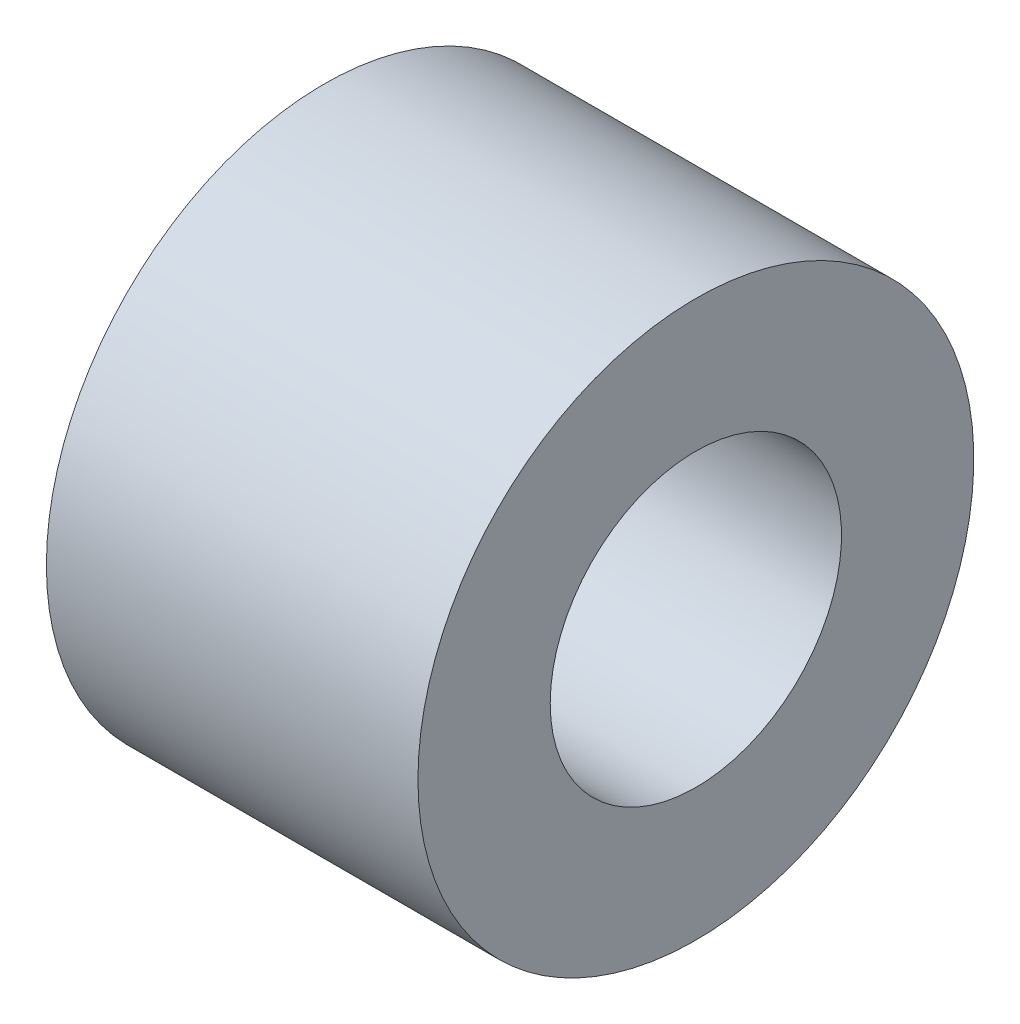
ISO-10303-21;
HEADER;
FILE_DESCRIPTION(('STEP AP214'),'2;1');
FILE_NAME('part.step','',(''),(''),'','','');
FILE_SCHEMA(('AUTOMOTIVE_DESIGN { 1 0 10303 214 1 1 1 1 }'));
ENDSEC;
DATA;
#1=APPLICATION_CONTEXT('core data for automotive mechanical design processes');
#2=APPLICATION_PROTOCOL_DEFINITION('international standard','automotive_design',2000,#1);
#3=PRODUCT_CONTEXT('',#1,'mechanical');
#4=PRODUCT('Part','Part','',(#3));
#5=PRODUCT_RELATED_PRODUCT_CATEGORY('part','',(#4));
#6=PRODUCT_DEFINITION_FORMATION('','',#4);
#7=PRODUCT_DEFINITION_CONTEXT('part definition',#1,'design');
#8=PRODUCT_DEFINITION('design','',#6,#7);
#9=PRODUCT_DEFINITION_SHAPE('','',#8);
#10=(LENGTH_UNIT() NAMED_UNIT(*) SI_UNIT(.MILLI.,.METRE.));
#11=(NAMED_UNIT(*) PLANE_ANGLE_UNIT() SI_UNIT($,.RADIAN.));
#12=(NAMED_UNIT(*) SI_UNIT($,.STERADIAN.) SOLID_ANGLE_UNIT());
#13=UNCERTAINTY_MEASURE_WITH_UNIT(LENGTH_MEASURE(1.E-05),#10,'distance_accuracy_value','');
#14=(GEOMETRIC_REPRESENTATION_CONTEXT(3) GLOBAL_UNCERTAINTY_ASSIGNED_CONTEXT((#13)) GLOBAL_UNIT_ASSIGNED_CONTEXT((#10,
#11,#12)) REPRESENTATION_CONTEXT('',''));
#15=CARTESIAN_POINT('',(0.,0.,0.));
#16=DIRECTION('',(0.,0.,1.));
#17=DIRECTION('',(1.,0.,0.));
#18=AXIS2_PLACEMENT_3D('',#15,#16,#17);
#19=CARTESIAN_POINT('',(3.175,0.,0.));
#20=DIRECTION('',(-1.,0.,0.));
#21=DIRECTION('',(0.,0.,1.));
#22=AXIS2_PLACEMENT_3D('',#19,#20,#21);
#23=CYLINDRICAL_SURFACE('',#22,2.4892);
#24=CARTESIAN_POINT('',(-3.175,0.,0.));
#25=DIRECTION('',(-1.,0.,0.));
#26=DIRECTION('',(0.,0.,1.));
#27=AXIS2_PLACEMENT_3D('',#24,#25,#26);
#28=CIRCLE('',#27,2.4892);
#29=CARTESIAN_POINT('',(-3.175,0.,2.4892));
#30=VERTEX_POINT('',#29);
#31=EDGE_CURVE('E26',#30,#30,#28,.T.);
#32=ORIENTED_EDGE('',*,*,#31,.T.);
#33=EDGE_LOOP('',(#32));
#34=FACE_BOUND('',#33,.T.);
#35=CARTESIAN_POINT('',(3.175,0.,0.));
#36=DIRECTION('',(-1.,0.,0.));
#37=DIRECTION('',(0.,0.,1.));
#38=AXIS2_PLACEMENT_3D('',#35,#36,#37);
#39=CIRCLE('',#38,2.4892);
#40=CARTESIAN_POINT('',(3.175,0.,2.4892));
#41=VERTEX_POINT('',#40);
#42=EDGE_CURVE('E17',#41,#41,#39,.T.);
#43=ORIENTED_EDGE('',*,*,#42,.F.);
#44=EDGE_LOOP('',(#43));
#45=FACE_BOUND('',#44,.T.);
#46=ADVANCED_FACE('F14',(#34,#45),#23,.F.);
#47=CARTESIAN_POINT('',(3.175,0.,0.));
#48=DIRECTION('',(1.,0.,0.));
#49=DIRECTION('',(0.,0.,-1.));
#50=AXIS2_PLACEMENT_3D('',#47,#48,#49);
#51=PLANE('',#50);
#52=ORIENTED_EDGE('',*,*,#42,.T.);
#53=EDGE_LOOP('',(#52));
#54=FACE_BOUND('',#53,.T.);
#55=CARTESIAN_POINT('',(3.175,0.,0.));
#56=DIRECTION('',(-1.,0.,0.));
#57=DIRECTION('',(0.,0.,1.));
#58=AXIS2_PLACEMENT_3D('',#55,#56,#57);
#59=CIRCLE('',#58,4.7498);
#60=CARTESIAN_POINT('',(3.175,0.,4.7498));
#61=VERTEX_POINT('',#60);
#62=EDGE_CURVE('E21',#61,#61,#59,.T.);
#63=ORIENTED_EDGE('',*,*,#62,.F.);
#64=EDGE_LOOP('',(#63));
#65=FACE_BOUND('',#64,.T.);
#66=ADVANCED_FACE('F34',(#54,#65),#51,.T.);
#67=CARTESIAN_POINT('',(-3.175,0.,0.));
#68=DIRECTION('',(1.,0.,0.));
#69=DIRECTION('',(0.,0.,-1.));
#70=AXIS2_PLACEMENT_3D('',#67,#68,#69);
#71=PLANE('',#70);
#72=ORIENTED_EDGE('',*,*,#31,.F.);
#73=EDGE_LOOP('',(#72));
#74=FACE_BOUND('',#73,.T.);
#75=CARTESIAN_POINT('',(-3.175,0.,0.));
#76=DIRECTION('',(-1.,0.,0.));
#77=DIRECTION('',(0.,0.,1.));
#78=AXIS2_PLACEMENT_3D('',#75,#76,#77);
#79=CIRCLE('',#78,4.7498);
#80=CARTESIAN_POINT('',(-3.175,0.,4.7498));
#81=VERTEX_POINT('',#80);
#82=EDGE_CURVE('E10',#81,#81,#79,.F.);
#83=ORIENTED_EDGE('',*,*,#82,.F.);
#84=EDGE_LOOP('',(#83));
#85=FACE_BOUND('',#84,.T.);
#86=ADVANCED_FACE('F42',(#74,#85),#71,.F.);
#87=CARTESIAN_POINT('',(3.175,0.,0.));
#88=DIRECTION('',(-1.,0.,0.));
#89=DIRECTION('',(0.,0.,1.));
#90=AXIS2_PLACEMENT_3D('',#87,#88,#89);
#91=CYLINDRICAL_SURFACE('',#90,4.7498);
#92=ORIENTED_EDGE('',*,*,#82,.T.);
#93=EDGE_LOOP('',(#92));
#94=FACE_BOUND('',#93,.T.);
#95=ORIENTED_EDGE('',*,*,#62,.T.);
#96=EDGE_LOOP('',(#95));
#97=FACE_BOUND('',#96,.T.);
#98=ADVANCED_FACE('F43',(#94,#97),#91,.T.);
#99=CLOSED_SHELL('',(#46,#66,#86,#98));
#100=MANIFOLD_SOLID_BREP('B1',#99);
#101=ADVANCED_BREP_SHAPE_REPRESENTATION('',(#18,#100),#14);
#102=SHAPE_DEFINITION_REPRESENTATION(#9,#101);
ENDSEC;
END-ISO-10303-21;
